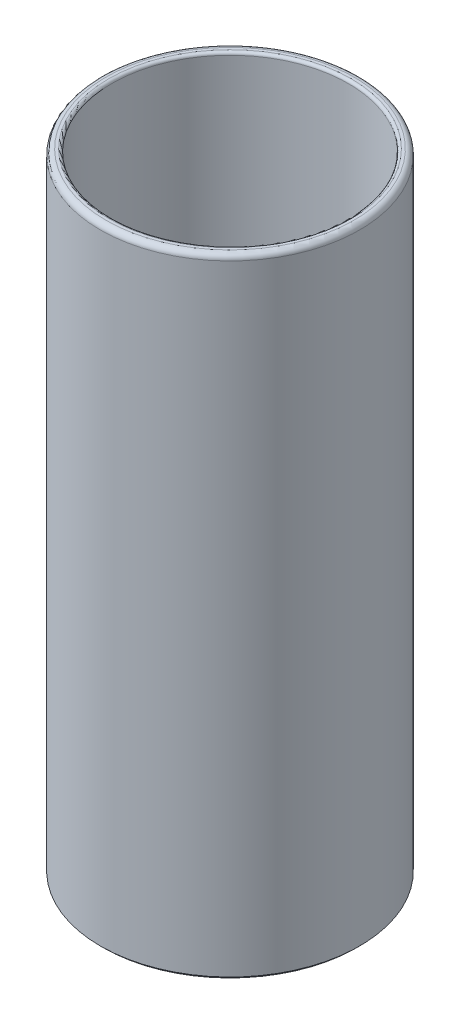
ISO-10303-21;
HEADER;
FILE_DESCRIPTION(('STEP AP214'),'2;1');
FILE_NAME('part.step','',(''),(''),'','','');
FILE_SCHEMA(('AUTOMOTIVE_DESIGN { 1 0 10303 214 1 1 1 1 }'));
ENDSEC;
DATA;
#1=APPLICATION_CONTEXT('core data for automotive mechanical design processes');
#2=APPLICATION_PROTOCOL_DEFINITION('international standard','automotive_design',2000,#1);
#3=PRODUCT_CONTEXT('',#1,'mechanical');
#4=PRODUCT('Part','Part','',(#3));
#5=PRODUCT_RELATED_PRODUCT_CATEGORY('part','',(#4));
#6=PRODUCT_DEFINITION_FORMATION('','',#4);
#7=PRODUCT_DEFINITION_CONTEXT('part definition',#1,'design');
#8=PRODUCT_DEFINITION('design','',#6,#7);
#9=PRODUCT_DEFINITION_SHAPE('','',#8);
#10=(LENGTH_UNIT() NAMED_UNIT(*) SI_UNIT(.MILLI.,.METRE.));
#11=(NAMED_UNIT(*) PLANE_ANGLE_UNIT() SI_UNIT($,.RADIAN.));
#12=(NAMED_UNIT(*) SI_UNIT($,.STERADIAN.) SOLID_ANGLE_UNIT());
#13=UNCERTAINTY_MEASURE_WITH_UNIT(LENGTH_MEASURE(1.E-05),#10,'distance_accuracy_value','');
#14=(GEOMETRIC_REPRESENTATION_CONTEXT(3) GLOBAL_UNCERTAINTY_ASSIGNED_CONTEXT((#13)) GLOBAL_UNIT_ASSIGNED_CONTEXT((#10,
#11,#12)) REPRESENTATION_CONTEXT('',''));
#15=CARTESIAN_POINT('',(0.,0.,0.));
#16=DIRECTION('',(0.,0.,1.));
#17=DIRECTION('',(1.,0.,0.));
#18=AXIS2_PLACEMENT_3D('',#15,#16,#17);
#19=CARTESIAN_POINT('',(0.,224.,0.));
#20=DIRECTION('',(0.,-1.,0.));
#21=DIRECTION('',(0.,0.,-1.));
#22=AXIS2_PLACEMENT_3D('',#19,#20,#21);
#23=CYLINDRICAL_SURFACE('',#22,46.2);
#24=CARTESIAN_POINT('',(0.,1.,0.));
#25=DIRECTION('',(0.,1.,0.));
#26=DIRECTION('',(0.,0.,1.));
#27=AXIS2_PLACEMENT_3D('',#24,#25,#26);
#28=CIRCLE('',#27,46.2);
#29=CARTESIAN_POINT('',(0.,1.,46.2));
#30=VERTEX_POINT('',#29);
#31=EDGE_CURVE('E54',#30,#30,#28,.T.);
#32=ORIENTED_EDGE('',*,*,#31,.T.);
#33=EDGE_LOOP('',(#32));
#34=FACE_BOUND('',#33,.T.);
#35=CARTESIAN_POINT('',(0.,222.,0.));
#36=DIRECTION('',(0.,1.,0.));
#37=DIRECTION('',(0.,0.,1.));
#38=AXIS2_PLACEMENT_3D('',#35,#36,#37);
#39=CIRCLE('',#38,46.2);
#40=CARTESIAN_POINT('',(0.,222.,46.2));
#41=VERTEX_POINT('',#40);
#42=EDGE_CURVE('E70',#41,#41,#39,.F.);
#43=ORIENTED_EDGE('',*,*,#42,.T.);
#44=EDGE_LOOP('',(#43));
#45=FACE_BOUND('',#44,.T.);
#46=ADVANCED_FACE('F45',(#34,#45),#23,.T.);
#47=CARTESIAN_POINT('',(0.,224.,0.));
#48=DIRECTION('',(0.,1.,0.));
#49=DIRECTION('',(0.,0.,1.));
#50=AXIS2_PLACEMENT_3D('',#47,#48,#49);
#51=PLANE('',#50);
#52=CARTESIAN_POINT('',(0.,224.,0.));
#53=DIRECTION('',(0.,1.,0.));
#54=DIRECTION('',(0.,0.,1.));
#55=AXIS2_PLACEMENT_3D('',#52,#53,#54);
#56=CIRCLE('',#55,43.2);
#57=CARTESIAN_POINT('',(0.,224.,43.2));
#58=VERTEX_POINT('',#57);
#59=EDGE_CURVE('E59',#58,#58,#56,.F.);
#60=ORIENTED_EDGE('',*,*,#59,.T.);
#61=EDGE_LOOP('',(#60));
#62=FACE_BOUND('',#61,.T.);
#63=CARTESIAN_POINT('',(0.,224.,0.));
#64=DIRECTION('',(0.,1.,0.));
#65=DIRECTION('',(0.,0.,1.));
#66=AXIS2_PLACEMENT_3D('',#63,#64,#65);
#67=CIRCLE('',#66,44.2);
#68=CARTESIAN_POINT('',(0.,224.,44.2));
#69=VERTEX_POINT('',#68);
#70=EDGE_CURVE('E74',#69,#69,#67,.T.);
#71=ORIENTED_EDGE('',*,*,#70,.T.);
#72=EDGE_LOOP('',(#71));
#73=FACE_BOUND('',#72,.T.);
#74=ADVANCED_FACE('F106',(#62,#73),#51,.T.);
#75=CARTESIAN_POINT('',(0.,0.,0.));
#76=DIRECTION('',(0.,1.,0.));
#77=DIRECTION('',(0.,0.,1.));
#78=AXIS2_PLACEMENT_3D('',#75,#76,#77);
#79=PLANE('',#78);
#80=CARTESIAN_POINT('',(0.,0.,0.));
#81=DIRECTION('',(0.,1.,0.));
#82=DIRECTION('',(0.,0.,1.));
#83=AXIS2_PLACEMENT_3D('',#80,#81,#82);
#84=CIRCLE('',#83,45.2);
#85=CARTESIAN_POINT('',(0.,0.,45.2));
#86=VERTEX_POINT('',#85);
#87=EDGE_CURVE('E10',#86,#86,#84,.F.);
#88=ORIENTED_EDGE('',*,*,#87,.T.);
#89=EDGE_LOOP('',(#88));
#90=FACE_BOUND('',#89,.T.);
#91=ADVANCED_FACE('F112',(#90),#79,.F.);
#92=CARTESIAN_POINT('',(0.,224.,0.));
#93=DIRECTION('',(0.,-1.,0.));
#94=DIRECTION('',(0.,0.,-1.));
#95=AXIS2_PLACEMENT_3D('',#92,#93,#94);
#96=CYLINDRICAL_SURFACE('',#95,42.2);
#97=CARTESIAN_POINT('',(0.,223.,0.));
#98=DIRECTION('',(0.,1.,0.));
#99=DIRECTION('',(0.,0.,1.));
#100=AXIS2_PLACEMENT_3D('',#97,#98,#99);
#101=CIRCLE('',#100,42.2);
#102=CARTESIAN_POINT('',(0.,223.,42.2));
#103=VERTEX_POINT('',#102);
#104=EDGE_CURVE('E64',#103,#103,#101,.T.);
#105=ORIENTED_EDGE('',*,*,#104,.T.);
#106=EDGE_LOOP('',(#105));
#107=FACE_BOUND('',#106,.T.);
#108=CARTESIAN_POINT('',(0.,6.00000000000001,0.));
#109=DIRECTION('',(0.,1.,0.));
#110=DIRECTION('',(0.,0.,1.));
#111=AXIS2_PLACEMENT_3D('',#108,#109,#110);
#112=CIRCLE('',#111,42.2);
#113=CARTESIAN_POINT('',(0.,6.00000000000001,42.2));
#114=VERTEX_POINT('',#113);
#115=EDGE_CURVE('E78',#114,#114,#112,.F.);
#116=ORIENTED_EDGE('',*,*,#115,.T.);
#117=EDGE_LOOP('',(#116));
#118=FACE_BOUND('',#117,.T.);
#119=ADVANCED_FACE('F101',(#107,#118),#96,.F.);
#120=CARTESIAN_POINT('',(0.,4.,0.));
#121=DIRECTION('',(0.,1.,0.));
#122=DIRECTION('',(0.,0.,1.));
#123=AXIS2_PLACEMENT_3D('',#120,#121,#122);
#124=PLANE('',#123);
#125=CARTESIAN_POINT('',(0.,4.,0.));
#126=DIRECTION('',(0.,1.,0.));
#127=DIRECTION('',(0.,0.,1.));
#128=AXIS2_PLACEMENT_3D('',#125,#126,#127);
#129=CIRCLE('',#128,40.2);
#130=CARTESIAN_POINT('',(0.,4.,40.2));
#131=VERTEX_POINT('',#130);
#132=EDGE_CURVE('E82',#131,#131,#129,.T.);
#133=ORIENTED_EDGE('',*,*,#132,.T.);
#134=EDGE_LOOP('',(#133));
#135=FACE_BOUND('',#134,.T.);
#136=ADVANCED_FACE('F87',(#135),#124,.T.);
#137=CARTESIAN_POINT('',(0.,6.00000000000001,0.));
#138=DIRECTION('',(0.,1.,0.));
#139=DIRECTION('',(0.,0.,1.));
#140=AXIS2_PLACEMENT_3D('',#137,#138,#139);
#141=TOROIDAL_SURFACE('',#140,40.2,2.);
#142=ORIENTED_EDGE('',*,*,#115,.F.);
#143=EDGE_LOOP('',(#142));
#144=FACE_BOUND('',#143,.T.);
#145=ORIENTED_EDGE('',*,*,#132,.F.);
#146=EDGE_LOOP('',(#145));
#147=FACE_BOUND('',#146,.T.);
#148=ADVANCED_FACE('F89',(#144,#147),#141,.F.);
#149=CARTESIAN_POINT('',(0.,222.,0.));
#150=DIRECTION('',(0.,1.,0.));
#151=DIRECTION('',(0.,0.,1.));
#152=AXIS2_PLACEMENT_3D('',#149,#150,#151);
#153=TOROIDAL_SURFACE('',#152,44.2,2.);
#154=ORIENTED_EDGE('',*,*,#42,.F.);
#155=EDGE_LOOP('',(#154));
#156=FACE_BOUND('',#155,.T.);
#157=ORIENTED_EDGE('',*,*,#70,.F.);
#158=EDGE_LOOP('',(#157));
#159=FACE_BOUND('',#158,.T.);
#160=ADVANCED_FACE('F91',(#156,#159),#153,.T.);
#161=CARTESIAN_POINT('',(0.,223.,0.));
#162=DIRECTION('',(0.,1.,0.));
#163=DIRECTION('',(0.,0.,1.));
#164=AXIS2_PLACEMENT_3D('',#161,#162,#163);
#165=TOROIDAL_SURFACE('',#164,43.2,1.);
#166=ORIENTED_EDGE('',*,*,#59,.F.);
#167=EDGE_LOOP('',(#166));
#168=FACE_BOUND('',#167,.T.);
#169=ORIENTED_EDGE('',*,*,#104,.F.);
#170=EDGE_LOOP('',(#169));
#171=FACE_BOUND('',#170,.T.);
#172=ADVANCED_FACE('F98',(#168,#171),#165,.T.);
#173=CARTESIAN_POINT('',(0.,1.,0.));
#174=DIRECTION('',(0.,1.,0.));
#175=DIRECTION('',(0.,0.,1.));
#176=AXIS2_PLACEMENT_3D('',#173,#174,#175);
#177=CONICAL_SURFACE('',#176,46.2,0.785398163397459);
#178=ORIENTED_EDGE('',*,*,#87,.F.);
#179=EDGE_LOOP('',(#178));
#180=FACE_BOUND('',#179,.T.);
#181=ORIENTED_EDGE('',*,*,#31,.F.);
#182=EDGE_LOOP('',(#181));
#183=FACE_BOUND('',#182,.T.);
#184=ADVANCED_FACE('F48',(#180,#183),#177,.T.);
#185=CLOSED_SHELL('',(#46,#74,#91,#119,#136,#148,#160,#172,#184));
#186=MANIFOLD_SOLID_BREP('B2',#185);
#187=ADVANCED_BREP_SHAPE_REPRESENTATION('',(#18,#186),#14);
#188=SHAPE_DEFINITION_REPRESENTATION(#9,#187);
ENDSEC;
END-ISO-10303-21;
